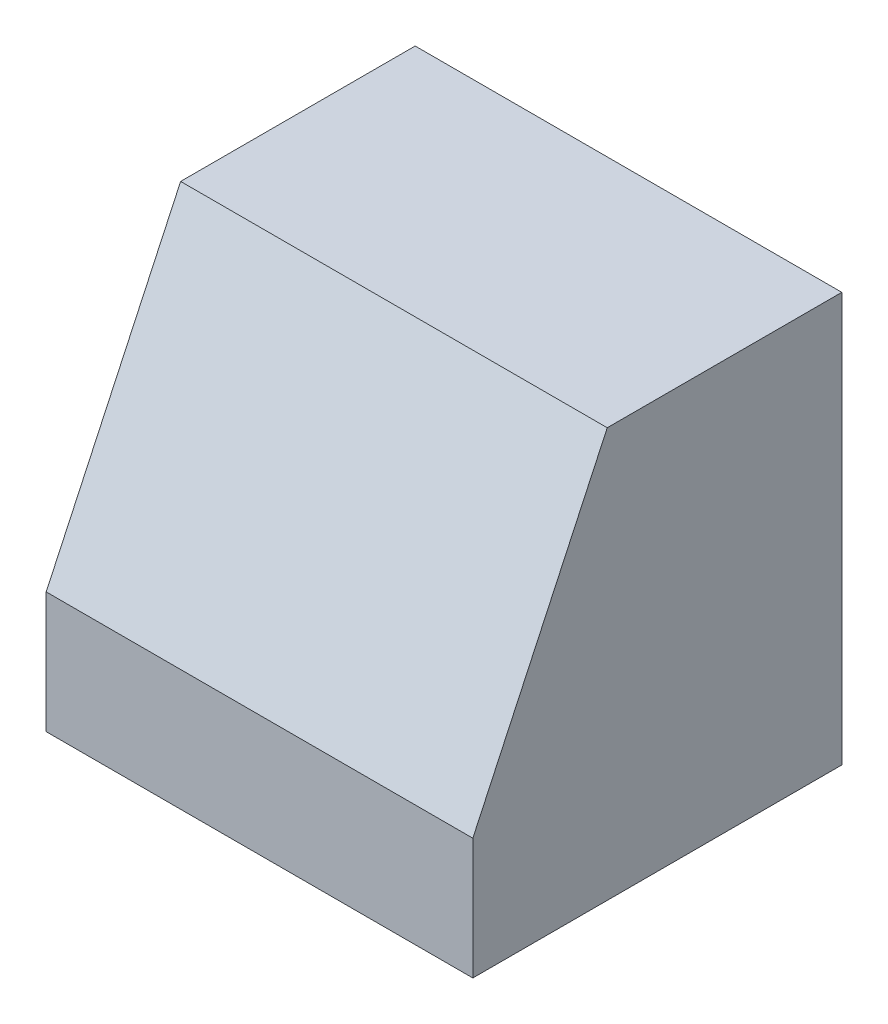
ISO-10303-21;
HEADER;
FILE_DESCRIPTION(('STEP AP214'),'2;1');
FILE_NAME('part.step','',(''),(''),'','','');
FILE_SCHEMA(('AUTOMOTIVE_DESIGN { 1 0 10303 214 1 1 1 1 }'));
ENDSEC;
DATA;
#1=APPLICATION_CONTEXT('core data for automotive mechanical design processes');
#2=APPLICATION_PROTOCOL_DEFINITION('international standard','automotive_design',2000,#1);
#3=PRODUCT_CONTEXT('',#1,'mechanical');
#4=PRODUCT('Part','Part','',(#3));
#5=PRODUCT_RELATED_PRODUCT_CATEGORY('part','',(#4));
#6=PRODUCT_DEFINITION_FORMATION('','',#4);
#7=PRODUCT_DEFINITION_CONTEXT('part definition',#1,'design');
#8=PRODUCT_DEFINITION('design','',#6,#7);
#9=PRODUCT_DEFINITION_SHAPE('','',#8);
#10=(LENGTH_UNIT() NAMED_UNIT(*) SI_UNIT(.MILLI.,.METRE.));
#11=(NAMED_UNIT(*) PLANE_ANGLE_UNIT() SI_UNIT($,.RADIAN.));
#12=(NAMED_UNIT(*) SI_UNIT($,.STERADIAN.) SOLID_ANGLE_UNIT());
#13=UNCERTAINTY_MEASURE_WITH_UNIT(LENGTH_MEASURE(1.E-05),#10,'distance_accuracy_value','');
#14=(GEOMETRIC_REPRESENTATION_CONTEXT(3) GLOBAL_UNCERTAINTY_ASSIGNED_CONTEXT((#13)) GLOBAL_UNIT_ASSIGNED_CONTEXT((#10,
#11,#12)) REPRESENTATION_CONTEXT('',''));
#15=CARTESIAN_POINT('',(0.,0.,0.));
#16=DIRECTION('',(0.,0.,1.));
#17=DIRECTION('',(1.,0.,0.));
#18=AXIS2_PLACEMENT_3D('',#15,#16,#17);
#19=CARTESIAN_POINT('',(0.7546875,0.,6.4));
#20=DIRECTION('',(1.,0.,0.));
#21=DIRECTION('',(0.,1.,0.));
#22=AXIS2_PLACEMENT_3D('',#19,#20,#21);
#23=PLANE('',#22);
#24=DIRECTION('',(0.,0.,-1.));
#25=VECTOR('',#24,1.);
#26=CARTESIAN_POINT('',(0.7546875,0.86953125,6.4));
#27=LINE('',#26,#25);
#28=CARTESIAN_POINT('',(0.7546875,0.86953125,4.068461709225));
#29=VERTEX_POINT('',#28);
#30=CARTESIAN_POINT('',(0.7546875,0.86953125,0.));
#31=VERTEX_POINT('',#30);
#32=EDGE_CURVE('E114',#29,#31,#27,.T.);
#33=ORIENTED_EDGE('',*,*,#32,.F.);
#34=DIRECTION('',(0.,0.906307787036651,-0.422618261740697));
#35=VECTOR('',#34,1.);
#36=CARTESIAN_POINT('',(0.7546875,-0.737727307651276,4.81793868329295));
#37=LINE('',#36,#35);
#38=CARTESIAN_POINT('',(0.754687500000001,-4.13046875000004,6.4));
#39=VERTEX_POINT('',#38);
#40=EDGE_CURVE('E56',#29,#39,#37,.F.);
#41=ORIENTED_EDGE('',*,*,#40,.T.);
#42=DIRECTION('',(0.,-1.,0.));
#43=VECTOR('',#42,1.);
#44=CARTESIAN_POINT('',(0.7546875,0.,6.4));
#45=LINE('',#44,#43);
#46=CARTESIAN_POINT('',(0.754687500000001,-6.23046875,6.4));
#47=VERTEX_POINT('',#46);
#48=EDGE_CURVE('E85',#39,#47,#45,.T.);
#49=ORIENTED_EDGE('',*,*,#48,.T.);
#50=DIRECTION('',(0.,0.,-1.));
#51=VECTOR('',#50,1.);
#52=CARTESIAN_POINT('',(0.754687500000001,-6.23046875,6.4));
#53=LINE('',#52,#51);
#54=CARTESIAN_POINT('',(0.754687500000001,-6.23046875,0.));
#55=VERTEX_POINT('',#54);
#56=EDGE_CURVE('E96',#47,#55,#53,.T.);
#57=ORIENTED_EDGE('',*,*,#56,.T.);
#58=DIRECTION('',(0.,-1.,0.));
#59=VECTOR('',#58,1.);
#60=CARTESIAN_POINT('',(0.7546875,0.,0.));
#61=LINE('',#60,#59);
#62=EDGE_CURVE('E103',#31,#55,#61,.T.);
#63=ORIENTED_EDGE('',*,*,#62,.F.);
#64=EDGE_LOOP('',(#33,#41,#49,#57,#63));
#65=FACE_BOUND('',#64,.T.);
#66=ADVANCED_FACE('F34',(#65),#23,.T.);
#67=CARTESIAN_POINT('',(0.,0.86953125,6.4));
#68=DIRECTION('',(0.,1.,0.));
#69=DIRECTION('',(0.,0.,1.));
#70=AXIS2_PLACEMENT_3D('',#67,#68,#69);
#71=PLANE('',#70);
#72=DIRECTION('',(0.,0.,-1.));
#73=VECTOR('',#72,1.);
#74=CARTESIAN_POINT('',(-6.6453125,0.86953125,6.4));
#75=LINE('',#74,#73);
#76=CARTESIAN_POINT('',(-6.6453125,0.86953125,4.068461709225));
#77=VERTEX_POINT('',#76);
#78=CARTESIAN_POINT('',(-6.6453125,0.86953125,0.));
#79=VERTEX_POINT('',#78);
#80=EDGE_CURVE('E95',#77,#79,#75,.T.);
#81=ORIENTED_EDGE('',*,*,#80,.F.);
#82=DIRECTION('',(1.,0.,0.));
#83=VECTOR('',#82,1.);
#84=CARTESIAN_POINT('',(0.,0.86953125,4.068461709225));
#85=LINE('',#84,#83);
#86=EDGE_CURVE('E116',#77,#29,#85,.T.);
#87=ORIENTED_EDGE('',*,*,#86,.T.);
#88=ORIENTED_EDGE('',*,*,#32,.T.);
#89=DIRECTION('',(1.,0.,0.));
#90=VECTOR('',#89,1.);
#91=CARTESIAN_POINT('',(0.,0.86953125,0.));
#92=LINE('',#91,#90);
#93=EDGE_CURVE('E106',#79,#31,#92,.T.);
#94=ORIENTED_EDGE('',*,*,#93,.F.);
#95=EDGE_LOOP('',(#81,#87,#88,#94));
#96=FACE_BOUND('',#95,.T.);
#97=ADVANCED_FACE('F122',(#96),#71,.T.);
#98=CARTESIAN_POINT('',(-6.6453125,0.,6.4));
#99=DIRECTION('',(1.,0.,0.));
#100=DIRECTION('',(0.,1.,0.));
#101=AXIS2_PLACEMENT_3D('',#98,#99,#100);
#102=PLANE('',#101);
#103=DIRECTION('',(0.,-1.,0.));
#104=VECTOR('',#103,1.);
#105=CARTESIAN_POINT('',(-6.6453125,0.,6.4));
#106=LINE('',#105,#104);
#107=CARTESIAN_POINT('',(-6.6453125,-4.13046875000004,6.4));
#108=VERTEX_POINT('',#107);
#109=CARTESIAN_POINT('',(-6.6453125,-6.23046875,6.4));
#110=VERTEX_POINT('',#109);
#111=EDGE_CURVE('E77',#108,#110,#106,.T.);
#112=ORIENTED_EDGE('',*,*,#111,.F.);
#113=DIRECTION('',(0.,-0.906307787036651,0.422618261740697));
#114=VECTOR('',#113,1.);
#115=CARTESIAN_POINT('',(-6.6453125,0.869531249999999,4.068461709225));
#116=LINE('',#115,#114);
#117=EDGE_CURVE('E11',#108,#77,#116,.F.);
#118=ORIENTED_EDGE('',*,*,#117,.T.);
#119=ORIENTED_EDGE('',*,*,#80,.T.);
#120=DIRECTION('',(0.,-1.,0.));
#121=VECTOR('',#120,1.);
#122=CARTESIAN_POINT('',(-6.6453125,0.,0.));
#123=LINE('',#122,#121);
#124=CARTESIAN_POINT('',(-6.6453125,-6.23046875,0.));
#125=VERTEX_POINT('',#124);
#126=EDGE_CURVE('E91',#79,#125,#123,.T.);
#127=ORIENTED_EDGE('',*,*,#126,.T.);
#128=DIRECTION('',(0.,0.,-1.));
#129=VECTOR('',#128,1.);
#130=CARTESIAN_POINT('',(-6.6453125,-6.23046875,6.4));
#131=LINE('',#130,#129);
#132=EDGE_CURVE('E88',#110,#125,#131,.T.);
#133=ORIENTED_EDGE('',*,*,#132,.F.);
#134=EDGE_LOOP('',(#112,#118,#119,#127,#133));
#135=FACE_BOUND('',#134,.T.);
#136=ADVANCED_FACE('F89',(#135),#102,.F.);
#137=CARTESIAN_POINT('',(0.,-6.23046875,6.4));
#138=DIRECTION('',(0.,1.,0.));
#139=DIRECTION('',(0.,0.,1.));
#140=AXIS2_PLACEMENT_3D('',#137,#138,#139);
#141=PLANE('',#140);
#142=DIRECTION('',(1.,0.,0.));
#143=VECTOR('',#142,1.);
#144=CARTESIAN_POINT('',(0.,-6.23046875,0.));
#145=LINE('',#144,#143);
#146=EDGE_CURVE('E111',#125,#55,#145,.T.);
#147=ORIENTED_EDGE('',*,*,#146,.T.);
#148=ORIENTED_EDGE('',*,*,#56,.F.);
#149=DIRECTION('',(1.,0.,0.));
#150=VECTOR('',#149,1.);
#151=CARTESIAN_POINT('',(0.,-6.23046875,6.4));
#152=LINE('',#151,#150);
#153=EDGE_CURVE('E81',#110,#47,#152,.T.);
#154=ORIENTED_EDGE('',*,*,#153,.F.);
#155=ORIENTED_EDGE('',*,*,#132,.T.);
#156=EDGE_LOOP('',(#147,#148,#154,#155));
#157=FACE_BOUND('',#156,.T.);
#158=ADVANCED_FACE('F98',(#157),#141,.F.);
#159=CARTESIAN_POINT('',(0.,0.,6.4));
#160=DIRECTION('',(0.,0.,1.));
#161=DIRECTION('',(1.,0.,0.));
#162=AXIS2_PLACEMENT_3D('',#159,#160,#161);
#163=PLANE('',#162);
#164=ORIENTED_EDGE('',*,*,#48,.F.);
#165=DIRECTION('',(-1.,0.,0.));
#166=VECTOR('',#165,1.);
#167=CARTESIAN_POINT('',(0.,-4.13046875000004,6.4));
#168=LINE('',#167,#166);
#169=EDGE_CURVE('E42',#39,#108,#168,.T.);
#170=ORIENTED_EDGE('',*,*,#169,.T.);
#171=ORIENTED_EDGE('',*,*,#111,.T.);
#172=ORIENTED_EDGE('',*,*,#153,.T.);
#173=EDGE_LOOP('',(#164,#170,#171,#172));
#174=FACE_BOUND('',#173,.T.);
#175=ADVANCED_FACE('F79',(#174),#163,.T.);
#176=CARTESIAN_POINT('',(0.,0.,0.));
#177=DIRECTION('',(0.,0.,1.));
#178=DIRECTION('',(1.,0.,0.));
#179=AXIS2_PLACEMENT_3D('',#176,#177,#178);
#180=PLANE('',#179);
#181=CARTESIAN_POINT('',(-2.9453125,-2.38046875,0.));
#182=DIRECTION('',(0.,0.,1.));
#183=DIRECTION('',(1.,0.,0.));
#184=AXIS2_PLACEMENT_3D('',#181,#182,#183);
#185=CIRCLE('',#184,1.75);
#186=CARTESIAN_POINT('',(-1.1953125,-2.38046875,0.));
#187=VERTEX_POINT('',#186);
#188=EDGE_CURVE('E206',#187,#187,#185,.T.);
#189=ORIENTED_EDGE('',*,*,#188,.T.);
#190=EDGE_LOOP('',(#189));
#191=FACE_BOUND('',#190,.T.);
#192=ORIENTED_EDGE('',*,*,#62,.T.);
#193=ORIENTED_EDGE('',*,*,#146,.F.);
#194=ORIENTED_EDGE('',*,*,#126,.F.);
#195=ORIENTED_EDGE('',*,*,#93,.T.);
#196=EDGE_LOOP('',(#192,#193,#194,#195));
#197=FACE_BOUND('',#196,.T.);
#198=ADVANCED_FACE('F127',(#191,#197),#180,.F.);
#199=CARTESIAN_POINT('',(-2.9453125,-2.38046875,-1.3));
#200=DIRECTION('',(0.,0.,1.));
#201=DIRECTION('',(1.,0.,0.));
#202=AXIS2_PLACEMENT_3D('',#199,#200,#201);
#203=CYLINDRICAL_SURFACE('',#202,1.75);
#204=CARTESIAN_POINT('',(-2.9453125,-2.38046875,-1.3));
#205=DIRECTION('',(0.,0.,1.));
#206=DIRECTION('',(1.,0.,0.));
#207=AXIS2_PLACEMENT_3D('',#204,#205,#206);
#208=CIRCLE('',#207,1.75);
#209=CARTESIAN_POINT('',(-1.1953125,-2.38046875,-1.3));
#210=VERTEX_POINT('',#209);
#211=EDGE_CURVE('E107',#210,#210,#208,.T.);
#212=ORIENTED_EDGE('',*,*,#211,.T.);
#213=EDGE_LOOP('',(#212));
#214=FACE_BOUND('',#213,.T.);
#215=ORIENTED_EDGE('',*,*,#188,.F.);
#216=EDGE_LOOP('',(#215));
#217=FACE_BOUND('',#216,.T.);
#218=ADVANCED_FACE('F129',(#214,#217),#203,.T.);
#219=CARTESIAN_POINT('',(-2.9453125,-2.38046875,-1.3));
#220=DIRECTION('',(0.,0.,1.));
#221=DIRECTION('',(1.,0.,0.));
#222=AXIS2_PLACEMENT_3D('',#219,#220,#221);
#223=PLANE('',#222);
#224=ORIENTED_EDGE('',*,*,#211,.F.);
#225=EDGE_LOOP('',(#224));
#226=FACE_BOUND('',#225,.T.);
#227=ADVANCED_FACE('F136',(#226),#223,.F.);
#228=CARTESIAN_POINT('',(0.,0.86953125,4.068461709225));
#229=DIRECTION('',(0.,-0.422618261740697,-0.906307787036651));
#230=DIRECTION('',(1.,0.,0.));
#231=AXIS2_PLACEMENT_3D('',#228,#229,#230);
#232=PLANE('',#231);
#233=ORIENTED_EDGE('',*,*,#117,.F.);
#234=ORIENTED_EDGE('',*,*,#169,.F.);
#235=ORIENTED_EDGE('',*,*,#40,.F.);
#236=ORIENTED_EDGE('',*,*,#86,.F.);
#237=EDGE_LOOP('',(#233,#234,#235,#236));
#238=FACE_BOUND('',#237,.T.);
#239=ADVANCED_FACE('F36',(#238),#232,.F.);
#240=CLOSED_SHELL('',(#66,#97,#136,#158,#175,#198,#218,#227,#239));
#241=MANIFOLD_SOLID_BREP('B2',#240);
#242=ADVANCED_BREP_SHAPE_REPRESENTATION('',(#18,#241),#14);
#243=SHAPE_DEFINITION_REPRESENTATION(#9,#242);
ENDSEC;
END-ISO-10303-21;
